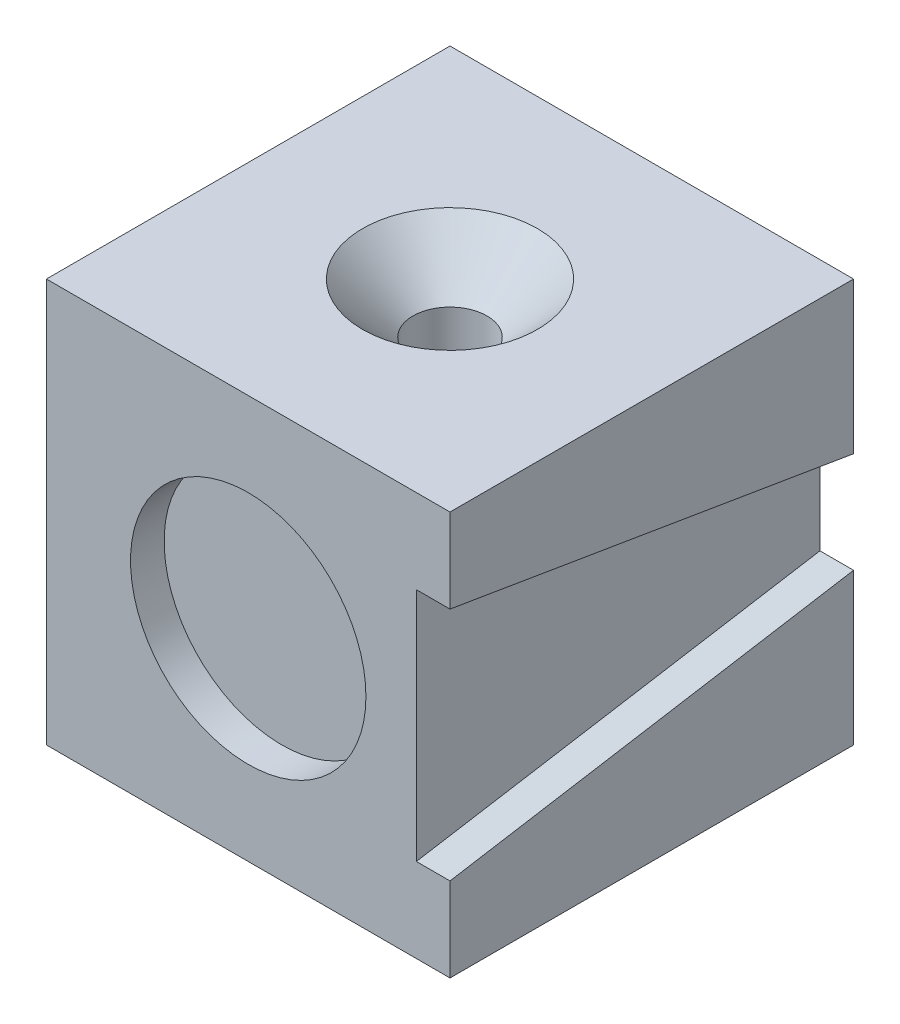
ISO-10303-21;
HEADER;
FILE_DESCRIPTION(('STEP AP214'),'2;1');
FILE_NAME('part.step','',(''),(''),'','','');
FILE_SCHEMA(('AUTOMOTIVE_DESIGN { 1 0 10303 214 1 1 1 1 }'));
ENDSEC;
DATA;
#1=APPLICATION_CONTEXT('core data for automotive mechanical design processes');
#2=APPLICATION_PROTOCOL_DEFINITION('international standard','automotive_design',2000,#1);
#3=PRODUCT_CONTEXT('',#1,'mechanical');
#4=PRODUCT('Part','Part','',(#3));
#5=PRODUCT_RELATED_PRODUCT_CATEGORY('part','',(#4));
#6=PRODUCT_DEFINITION_FORMATION('','',#4);
#7=PRODUCT_DEFINITION_CONTEXT('part definition',#1,'design');
#8=PRODUCT_DEFINITION('design','',#6,#7);
#9=PRODUCT_DEFINITION_SHAPE('','',#8);
#10=(LENGTH_UNIT() NAMED_UNIT(*) SI_UNIT(.MILLI.,.METRE.));
#11=(NAMED_UNIT(*) PLANE_ANGLE_UNIT() SI_UNIT($,.RADIAN.));
#12=(NAMED_UNIT(*) SI_UNIT($,.STERADIAN.) SOLID_ANGLE_UNIT());
#13=UNCERTAINTY_MEASURE_WITH_UNIT(LENGTH_MEASURE(1.E-05),#10,'distance_accuracy_value','');
#14=(GEOMETRIC_REPRESENTATION_CONTEXT(3) GLOBAL_UNCERTAINTY_ASSIGNED_CONTEXT((#13)) GLOBAL_UNIT_ASSIGNED_CONTEXT((#10,
#11,#12)) REPRESENTATION_CONTEXT('',''));
#15=CARTESIAN_POINT('',(0.,0.,0.));
#16=DIRECTION('',(0.,0.,1.));
#17=DIRECTION('',(1.,0.,0.));
#18=AXIS2_PLACEMENT_3D('',#15,#16,#17);
#19=CARTESIAN_POINT('',(-76.2,76.2,-76.2));
#20=DIRECTION('',(0.,0.,1.));
#21=DIRECTION('',(1.,0.,0.));
#22=AXIS2_PLACEMENT_3D('',#19,#20,#21);
#23=PLANE('',#22);
#24=DIRECTION('',(0.,-1.,0.));
#25=VECTOR('',#24,1.);
#26=CARTESIAN_POINT('',(76.2,76.2,-76.2));
#27=LINE('',#26,#25);
#28=CARTESIAN_POINT('',(76.2,76.2,-76.2));
#29=VERTEX_POINT('',#28);
#30=CARTESIAN_POINT('',(76.2,19.05,-76.2));
#31=VERTEX_POINT('',#30);
#32=EDGE_CURVE('E223',#29,#31,#27,.T.);
#33=ORIENTED_EDGE('',*,*,#32,.T.);
#34=DIRECTION('',(1.,0.,0.));
#35=VECTOR('',#34,1.);
#36=CARTESIAN_POINT('',(63.5,19.05,-76.2));
#37=LINE('',#36,#35);
#38=CARTESIAN_POINT('',(63.5,19.05,-76.2));
#39=VERTEX_POINT('',#38);
#40=EDGE_CURVE('E185',#39,#31,#37,.T.);
#41=ORIENTED_EDGE('',*,*,#40,.F.);
#42=DIRECTION('',(0.,1.,0.));
#43=VECTOR('',#42,1.);
#44=CARTESIAN_POINT('',(63.5,19.05,-76.2));
#45=LINE('',#44,#43);
#46=CARTESIAN_POINT('',(63.5000000000001,-19.05,-76.2));
#47=VERTEX_POINT('',#46);
#48=EDGE_CURVE('E173',#47,#39,#45,.T.);
#49=ORIENTED_EDGE('',*,*,#48,.F.);
#50=DIRECTION('',(1.,0.,0.));
#51=VECTOR('',#50,1.);
#52=CARTESIAN_POINT('',(63.5,-19.05,-76.2));
#53=LINE('',#52,#51);
#54=CARTESIAN_POINT('',(76.2,-19.05,-76.2));
#55=VERTEX_POINT('',#54);
#56=EDGE_CURVE('E187',#47,#55,#53,.T.);
#57=ORIENTED_EDGE('',*,*,#56,.T.);
#58=CARTESIAN_POINT('',(76.2,-76.2,-76.2));
#59=VERTEX_POINT('',#58);
#60=EDGE_CURVE('E222',#55,#59,#27,.T.);
#61=ORIENTED_EDGE('',*,*,#60,.T.);
#62=DIRECTION('',(-1.,0.,0.));
#63=VECTOR('',#62,1.);
#64=CARTESIAN_POINT('',(-76.2,-76.2,-76.2));
#65=LINE('',#64,#63);
#66=CARTESIAN_POINT('',(-76.2,-76.2,-76.2));
#67=VERTEX_POINT('',#66);
#68=EDGE_CURVE('E204',#59,#67,#65,.T.);
#69=ORIENTED_EDGE('',*,*,#68,.T.);
#70=DIRECTION('',(0.,-1.,0.));
#71=VECTOR('',#70,1.);
#72=CARTESIAN_POINT('',(-76.2,76.2,-76.2));
#73=LINE('',#72,#71);
#74=CARTESIAN_POINT('',(-76.2,76.2,-76.2));
#75=VERTEX_POINT('',#74);
#76=EDGE_CURVE('E210',#75,#67,#73,.T.);
#77=ORIENTED_EDGE('',*,*,#76,.F.);
#78=DIRECTION('',(-1.,0.,0.));
#79=VECTOR('',#78,1.);
#80=CARTESIAN_POINT('',(-76.2,76.2,-76.2));
#81=LINE('',#80,#79);
#82=EDGE_CURVE('E208',#29,#75,#81,.T.);
#83=ORIENTED_EDGE('',*,*,#82,.F.);
#84=EDGE_LOOP('',(#33,#41,#49,#57,#61,#69,#77,#83));
#85=FACE_BOUND('',#84,.T.);
#86=CARTESIAN_POINT('',(0.,0.,-76.2));
#87=DIRECTION('',(0.,0.,1.));
#88=DIRECTION('',(1.,0.,0.));
#89=AXIS2_PLACEMENT_3D('',#86,#87,#88);
#90=CIRCLE('',#89,25.4);
#91=CARTESIAN_POINT('',(25.4,0.,-76.2));
#92=VERTEX_POINT('',#91);
#93=EDGE_CURVE('E11',#92,#92,#90,.F.);
#94=ORIENTED_EDGE('',*,*,#93,.F.);
#95=EDGE_LOOP('',(#94));
#96=FACE_BOUND('',#95,.T.);
#97=ADVANCED_FACE('F32',(#85,#96),#23,.F.);
#98=CARTESIAN_POINT('',(76.2,76.2,-76.2));
#99=DIRECTION('',(-1.,0.,0.));
#100=DIRECTION('',(0.,0.,1.));
#101=AXIS2_PLACEMENT_3D('',#98,#99,#100);
#102=PLANE('',#101);
#103=DIRECTION('',(0.,-1.,0.));
#104=VECTOR('',#103,1.);
#105=CARTESIAN_POINT('',(76.2,76.2,76.2));
#106=LINE('',#105,#104);
#107=CARTESIAN_POINT('',(76.2,76.2,76.2));
#108=VERTEX_POINT('',#107);
#109=CARTESIAN_POINT('',(76.2,44.45,76.2));
#110=VERTEX_POINT('',#109);
#111=EDGE_CURVE('E227',#108,#110,#106,.T.);
#112=ORIENTED_EDGE('',*,*,#111,.T.);
#113=DIRECTION('',(0.,0.164398987305357,0.986393923832144));
#114=VECTOR('',#113,1.);
#115=CARTESIAN_POINT('',(76.2,44.45,76.2));
#116=LINE('',#115,#114);
#117=EDGE_CURVE('E171',#31,#110,#116,.T.);
#118=ORIENTED_EDGE('',*,*,#117,.F.);
#119=ORIENTED_EDGE('',*,*,#32,.F.);
#120=DIRECTION('',(0.,0.,-1.));
#121=VECTOR('',#120,1.);
#122=CARTESIAN_POINT('',(76.2,76.2,-76.2));
#123=LINE('',#122,#121);
#124=EDGE_CURVE('E206',#108,#29,#123,.T.);
#125=ORIENTED_EDGE('',*,*,#124,.F.);
#126=EDGE_LOOP('',(#112,#118,#119,#125));
#127=FACE_BOUND('',#126,.T.);
#128=ADVANCED_FACE('F264',(#127),#102,.F.);
#129=CARTESIAN_POINT('',(-76.2,76.2,-76.2));
#130=DIRECTION('',(1.,0.,0.));
#131=DIRECTION('',(0.,0.,-1.));
#132=AXIS2_PLACEMENT_3D('',#129,#130,#131);
#133=PLANE('',#132);
#134=DIRECTION('',(0.,0.,1.));
#135=VECTOR('',#134,1.);
#136=CARTESIAN_POINT('',(-76.2,-63.5,-63.5));
#137=LINE('',#136,#135);
#138=CARTESIAN_POINT('',(-76.2,-63.5,-63.5));
#139=VERTEX_POINT('',#138);
#140=CARTESIAN_POINT('',(-76.2,-63.5,63.5));
#141=VERTEX_POINT('',#140);
#142=EDGE_CURVE('E150',#139,#141,#137,.T.);
#143=ORIENTED_EDGE('',*,*,#142,.F.);
#144=DIRECTION('',(0.,-1.,0.));
#145=VECTOR('',#144,1.);
#146=CARTESIAN_POINT('',(-76.2,63.5,-63.5));
#147=LINE('',#146,#145);
#148=CARTESIAN_POINT('',(-76.2,63.5,-63.5));
#149=VERTEX_POINT('',#148);
#150=EDGE_CURVE('E47',#149,#139,#147,.T.);
#151=ORIENTED_EDGE('',*,*,#150,.F.);
#152=DIRECTION('',(0.,0.,-1.));
#153=VECTOR('',#152,1.);
#154=CARTESIAN_POINT('',(-76.2,63.5,-63.5));
#155=LINE('',#154,#153);
#156=CARTESIAN_POINT('',(-76.2,63.5,63.5));
#157=VERTEX_POINT('',#156);
#158=EDGE_CURVE('E141',#157,#149,#155,.T.);
#159=ORIENTED_EDGE('',*,*,#158,.F.);
#160=DIRECTION('',(0.,1.,0.));
#161=VECTOR('',#160,1.);
#162=CARTESIAN_POINT('',(-76.2,63.5,63.5));
#163=LINE('',#162,#161);
#164=EDGE_CURVE('E144',#141,#157,#163,.T.);
#165=ORIENTED_EDGE('',*,*,#164,.F.);
#166=EDGE_LOOP('',(#143,#151,#159,#165));
#167=FACE_BOUND('',#166,.T.);
#168=DIRECTION('',(0.,0.,1.));
#169=VECTOR('',#168,1.);
#170=CARTESIAN_POINT('',(-76.2,-76.2,-76.2));
#171=LINE('',#170,#169);
#172=CARTESIAN_POINT('',(-76.2,-76.2,76.2));
#173=VERTEX_POINT('',#172);
#174=EDGE_CURVE('E199',#67,#173,#171,.T.);
#175=ORIENTED_EDGE('',*,*,#174,.T.);
#176=DIRECTION('',(0.,-1.,0.));
#177=VECTOR('',#176,1.);
#178=CARTESIAN_POINT('',(-76.2,76.2,76.2));
#179=LINE('',#178,#177);
#180=CARTESIAN_POINT('',(-76.2,76.2,76.2));
#181=VERTEX_POINT('',#180);
#182=EDGE_CURVE('E40',#181,#173,#179,.T.);
#183=ORIENTED_EDGE('',*,*,#182,.F.);
#184=DIRECTION('',(0.,0.,1.));
#185=VECTOR('',#184,1.);
#186=CARTESIAN_POINT('',(-76.2,76.2,-76.2));
#187=LINE('',#186,#185);
#188=EDGE_CURVE('E200',#75,#181,#187,.T.);
#189=ORIENTED_EDGE('',*,*,#188,.F.);
#190=ORIENTED_EDGE('',*,*,#76,.T.);
#191=EDGE_LOOP('',(#175,#183,#189,#190));
#192=FACE_BOUND('',#191,.T.);
#193=ADVANCED_FACE('F34',(#167,#192),#133,.F.);
#194=CARTESIAN_POINT('',(-76.2,76.2,76.2));
#195=DIRECTION('',(0.,0.,-1.));
#196=DIRECTION('',(-1.,0.,0.));
#197=AXIS2_PLACEMENT_3D('',#194,#195,#196);
#198=PLANE('',#197);
#199=CARTESIAN_POINT('',(0.,0.,76.2));
#200=DIRECTION('',(0.,0.,1.));
#201=DIRECTION('',(1.,0.,0.));
#202=AXIS2_PLACEMENT_3D('',#199,#200,#201);
#203=CIRCLE('',#202,44.45);
#204=CARTESIAN_POINT('',(44.45,0.,76.2));
#205=VERTEX_POINT('',#204);
#206=EDGE_CURVE('E162',#205,#205,#203,.T.);
#207=ORIENTED_EDGE('',*,*,#206,.F.);
#208=EDGE_LOOP('',(#207));
#209=FACE_BOUND('',#208,.T.);
#210=DIRECTION('',(0.,-1.,0.));
#211=VECTOR('',#210,1.);
#212=CARTESIAN_POINT('',(63.5,-44.45,76.2));
#213=LINE('',#212,#211);
#214=CARTESIAN_POINT('',(63.5,44.45,76.2));
#215=VERTEX_POINT('',#214);
#216=CARTESIAN_POINT('',(63.5,-44.45,76.2));
#217=VERTEX_POINT('',#216);
#218=EDGE_CURVE('E169',#215,#217,#213,.T.);
#219=ORIENTED_EDGE('',*,*,#218,.F.);
#220=DIRECTION('',(1.,0.,0.));
#221=VECTOR('',#220,1.);
#222=CARTESIAN_POINT('',(63.5,44.45,76.2));
#223=LINE('',#222,#221);
#224=EDGE_CURVE('E181',#215,#110,#223,.T.);
#225=ORIENTED_EDGE('',*,*,#224,.T.);
#226=ORIENTED_EDGE('',*,*,#111,.F.);
#227=DIRECTION('',(1.,0.,0.));
#228=VECTOR('',#227,1.);
#229=CARTESIAN_POINT('',(-76.2,76.2,76.2));
#230=LINE('',#229,#228);
#231=EDGE_CURVE('E203',#181,#108,#230,.T.);
#232=ORIENTED_EDGE('',*,*,#231,.F.);
#233=ORIENTED_EDGE('',*,*,#182,.T.);
#234=DIRECTION('',(1.,0.,0.));
#235=VECTOR('',#234,1.);
#236=CARTESIAN_POINT('',(-76.2,-76.2,76.2));
#237=LINE('',#236,#235);
#238=CARTESIAN_POINT('',(76.2,-76.2,76.2));
#239=VERTEX_POINT('',#238);
#240=EDGE_CURVE('E213',#173,#239,#237,.T.);
#241=ORIENTED_EDGE('',*,*,#240,.T.);
#242=CARTESIAN_POINT('',(76.2,-44.45,76.2));
#243=VERTEX_POINT('',#242);
#244=EDGE_CURVE('E226',#243,#239,#106,.T.);
#245=ORIENTED_EDGE('',*,*,#244,.F.);
#246=DIRECTION('',(1.,0.,0.));
#247=VECTOR('',#246,1.);
#248=CARTESIAN_POINT('',(63.5,-44.45,76.2));
#249=LINE('',#248,#247);
#250=EDGE_CURVE('E178',#217,#243,#249,.T.);
#251=ORIENTED_EDGE('',*,*,#250,.F.);
#252=EDGE_LOOP('',(#219,#225,#226,#232,#233,#241,#245,#251));
#253=FACE_BOUND('',#252,.T.);
#254=ADVANCED_FACE('F233',(#209,#253),#198,.F.);
#255=ORIENTED_EDGE('',*,*,#60,.F.);
#256=DIRECTION('',(0.,0.164398987305357,-0.986393923832144));
#257=VECTOR('',#256,1.);
#258=CARTESIAN_POINT('',(76.2,-19.05,-76.2));
#259=LINE('',#258,#257);
#260=EDGE_CURVE('E166',#243,#55,#259,.T.);
#261=ORIENTED_EDGE('',*,*,#260,.F.);
#262=ORIENTED_EDGE('',*,*,#244,.T.);
#263=DIRECTION('',(0.,0.,-1.));
#264=VECTOR('',#263,1.);
#265=CARTESIAN_POINT('',(76.2,-76.2,-76.2));
#266=LINE('',#265,#264);
#267=EDGE_CURVE('E216',#239,#59,#266,.T.);
#268=ORIENTED_EDGE('',*,*,#267,.T.);
#269=EDGE_LOOP('',(#255,#261,#262,#268));
#270=FACE_BOUND('',#269,.T.);
#271=ADVANCED_FACE('F246',(#270),#102,.F.);
#272=CARTESIAN_POINT('',(0.,76.2,0.));
#273=DIRECTION('',(0.,1.,0.));
#274=DIRECTION('',(0.,0.,1.));
#275=AXIS2_PLACEMENT_3D('',#272,#273,#274);
#276=PLANE('',#275);
#277=CARTESIAN_POINT('',(0.,76.2,0.));
#278=DIRECTION('',(0.,-1.,0.));
#279=DIRECTION('',(0.,0.,-1.));
#280=AXIS2_PLACEMENT_3D('',#277,#278,#279);
#281=CIRCLE('',#280,33.0200000000002);
#282=CARTESIAN_POINT('',(0.,76.2,-33.0200000000002));
#283=VERTEX_POINT('',#282);
#284=EDGE_CURVE('E184',#283,#283,#281,.T.);
#285=ORIENTED_EDGE('',*,*,#284,.T.);
#286=EDGE_LOOP('',(#285));
#287=FACE_BOUND('',#286,.T.);
#288=ORIENTED_EDGE('',*,*,#188,.T.);
#289=ORIENTED_EDGE('',*,*,#231,.T.);
#290=ORIENTED_EDGE('',*,*,#124,.T.);
#291=ORIENTED_EDGE('',*,*,#82,.T.);
#292=EDGE_LOOP('',(#288,#289,#290,#291));
#293=FACE_BOUND('',#292,.T.);
#294=ADVANCED_FACE('F266',(#287,#293),#276,.T.);
#295=CARTESIAN_POINT('',(0.,-76.2,0.));
#296=DIRECTION('',(0.,1.,0.));
#297=DIRECTION('',(0.,0.,1.));
#298=AXIS2_PLACEMENT_3D('',#295,#296,#297);
#299=PLANE('',#298);
#300=ORIENTED_EDGE('',*,*,#174,.F.);
#301=ORIENTED_EDGE('',*,*,#68,.F.);
#302=ORIENTED_EDGE('',*,*,#267,.F.);
#303=ORIENTED_EDGE('',*,*,#240,.F.);
#304=EDGE_LOOP('',(#300,#301,#302,#303));
#305=FACE_BOUND('',#304,.T.);
#306=ADVANCED_FACE('F243',(#305),#299,.F.);
#307=CARTESIAN_POINT('',(0.,12.7,0.));
#308=DIRECTION('',(0.,-1.,0.));
#309=DIRECTION('',(0.,0.,-1.));
#310=AXIS2_PLACEMENT_3D('',#307,#308,#309);
#311=PLANE('',#310);
#312=CARTESIAN_POINT('',(0.,12.7,0.));
#313=DIRECTION('',(0.,-1.,0.));
#314=DIRECTION('',(0.,0.,-1.));
#315=AXIS2_PLACEMENT_3D('',#312,#313,#314);
#316=CIRCLE('',#315,13.97);
#317=CARTESIAN_POINT('',(0.,12.7,-13.97));
#318=VERTEX_POINT('',#317);
#319=EDGE_CURVE('E196',#318,#318,#316,.T.);
#320=ORIENTED_EDGE('',*,*,#319,.F.);
#321=EDGE_LOOP('',(#320));
#322=FACE_BOUND('',#321,.T.);
#323=ADVANCED_FACE('F274',(#322),#311,.F.);
#324=CARTESIAN_POINT('',(0.,0.,0.));
#325=DIRECTION('',(0.,-1.,0.));
#326=DIRECTION('',(0.,0.,-1.));
#327=AXIS2_PLACEMENT_3D('',#324,#325,#326);
#328=CYLINDRICAL_SURFACE('',#327,13.97);
#329=CARTESIAN_POINT('',(0.,57.15,0.));
#330=DIRECTION('',(0.,-1.,0.));
#331=DIRECTION('',(0.,0.,-1.));
#332=AXIS2_PLACEMENT_3D('',#329,#330,#331);
#333=CIRCLE('',#332,13.97);
#334=CARTESIAN_POINT('',(0.,57.15,-13.97));
#335=VERTEX_POINT('',#334);
#336=EDGE_CURVE('E193',#335,#335,#333,.T.);
#337=ORIENTED_EDGE('',*,*,#336,.F.);
#338=EDGE_LOOP('',(#337));
#339=FACE_BOUND('',#338,.T.);
#340=ORIENTED_EDGE('',*,*,#319,.T.);
#341=EDGE_LOOP('',(#340));
#342=FACE_BOUND('',#341,.T.);
#343=ADVANCED_FACE('F314',(#339,#342),#328,.F.);
#344=CARTESIAN_POINT('',(0.,57.15,0.));
#345=DIRECTION('',(0.,1.,0.));
#346=DIRECTION('',(0.,0.,1.));
#347=AXIS2_PLACEMENT_3D('',#344,#345,#346);
#348=CONICAL_SURFACE('',#347,13.97,0.785398163397453);
#349=ORIENTED_EDGE('',*,*,#284,.F.);
#350=EDGE_LOOP('',(#349));
#351=FACE_BOUND('',#350,.T.);
#352=ORIENTED_EDGE('',*,*,#336,.T.);
#353=EDGE_LOOP('',(#352));
#354=FACE_BOUND('',#353,.T.);
#355=ADVANCED_FACE('F309',(#351,#354),#348,.F.);
#356=CARTESIAN_POINT('',(63.5,44.45,76.2));
#357=DIRECTION('',(0.,0.986393923832144,-0.164398987305357));
#358=DIRECTION('',(0.,0.164398987305357,0.986393923832144));
#359=AXIS2_PLACEMENT_3D('',#356,#357,#358);
#360=PLANE('',#359);
#361=ORIENTED_EDGE('',*,*,#117,.T.);
#362=ORIENTED_EDGE('',*,*,#224,.F.);
#363=DIRECTION('',(0.,0.164398987305357,0.986393923832144));
#364=VECTOR('',#363,1.);
#365=CARTESIAN_POINT('',(63.5,44.45,76.2));
#366=LINE('',#365,#364);
#367=EDGE_CURVE('E175',#39,#215,#366,.T.);
#368=ORIENTED_EDGE('',*,*,#367,.F.);
#369=ORIENTED_EDGE('',*,*,#40,.T.);
#370=EDGE_LOOP('',(#361,#362,#368,#369));
#371=FACE_BOUND('',#370,.T.);
#372=ADVANCED_FACE('F256',(#371),#360,.F.);
#373=CARTESIAN_POINT('',(63.5,-19.05,-76.2));
#374=DIRECTION('',(0.,-0.986393923832144,-0.164398987305357));
#375=DIRECTION('',(0.,0.164398987305357,-0.986393923832144));
#376=AXIS2_PLACEMENT_3D('',#373,#374,#375);
#377=PLANE('',#376);
#378=ORIENTED_EDGE('',*,*,#260,.T.);
#379=ORIENTED_EDGE('',*,*,#56,.F.);
#380=DIRECTION('',(0.,0.164398987305357,-0.986393923832144));
#381=VECTOR('',#380,1.);
#382=CARTESIAN_POINT('',(63.5,-19.05,-76.2));
#383=LINE('',#382,#381);
#384=EDGE_CURVE('E55',#217,#47,#383,.T.);
#385=ORIENTED_EDGE('',*,*,#384,.F.);
#386=ORIENTED_EDGE('',*,*,#250,.T.);
#387=EDGE_LOOP('',(#378,#379,#385,#386));
#388=FACE_BOUND('',#387,.T.);
#389=ADVANCED_FACE('F250',(#388),#377,.F.);
#390=CARTESIAN_POINT('',(63.5,0.,0.));
#391=DIRECTION('',(-1.,0.,0.));
#392=DIRECTION('',(0.,0.,1.));
#393=AXIS2_PLACEMENT_3D('',#390,#391,#392);
#394=PLANE('',#393);
#395=ORIENTED_EDGE('',*,*,#218,.T.);
#396=ORIENTED_EDGE('',*,*,#384,.T.);
#397=ORIENTED_EDGE('',*,*,#48,.T.);
#398=ORIENTED_EDGE('',*,*,#367,.T.);
#399=EDGE_LOOP('',(#395,#396,#397,#398));
#400=FACE_BOUND('',#399,.T.);
#401=ADVANCED_FACE('F252',(#400),#394,.F.);
#402=CARTESIAN_POINT('',(0.,0.,63.5));
#403=DIRECTION('',(0.,0.,1.));
#404=DIRECTION('',(1.,0.,0.));
#405=AXIS2_PLACEMENT_3D('',#402,#403,#404);
#406=CYLINDRICAL_SURFACE('',#405,44.45);
#407=CARTESIAN_POINT('',(0.,0.,63.5));
#408=DIRECTION('',(0.,0.,1.));
#409=DIRECTION('',(1.,0.,0.));
#410=AXIS2_PLACEMENT_3D('',#407,#408,#409);
#411=CIRCLE('',#410,44.45);
#412=CARTESIAN_POINT('',(44.45,0.,63.5));
#413=VERTEX_POINT('',#412);
#414=EDGE_CURVE('E163',#413,#413,#411,.T.);
#415=ORIENTED_EDGE('',*,*,#414,.F.);
#416=EDGE_LOOP('',(#415));
#417=FACE_BOUND('',#416,.T.);
#418=ORIENTED_EDGE('',*,*,#206,.T.);
#419=EDGE_LOOP('',(#418));
#420=FACE_BOUND('',#419,.T.);
#421=ADVANCED_FACE('F291',(#417,#420),#406,.F.);
#422=CARTESIAN_POINT('',(0.,0.,63.5));
#423=DIRECTION('',(0.,0.,1.));
#424=DIRECTION('',(1.,0.,0.));
#425=AXIS2_PLACEMENT_3D('',#422,#423,#424);
#426=PLANE('',#425);
#427=ORIENTED_EDGE('',*,*,#414,.T.);
#428=EDGE_LOOP('',(#427));
#429=FACE_BOUND('',#428,.T.);
#430=ADVANCED_FACE('F293',(#429),#426,.T.);
#431=CARTESIAN_POINT('',(0.,0.,-101.6));
#432=DIRECTION('',(0.,0.,1.));
#433=DIRECTION('',(1.,0.,0.));
#434=AXIS2_PLACEMENT_3D('',#431,#432,#433);
#435=CYLINDRICAL_SURFACE('',#434,25.4);
#436=CARTESIAN_POINT('',(0.,0.,-101.6));
#437=DIRECTION('',(0.,0.,-1.));
#438=DIRECTION('',(-1.,0.,0.));
#439=AXIS2_PLACEMENT_3D('',#436,#437,#438);
#440=CIRCLE('',#439,25.4);
#441=CARTESIAN_POINT('',(-25.4,0.,-101.6));
#442=VERTEX_POINT('',#441);
#443=EDGE_CURVE('E156',#442,#442,#440,.T.);
#444=ORIENTED_EDGE('',*,*,#443,.F.);
#445=EDGE_LOOP('',(#444));
#446=FACE_BOUND('',#445,.T.);
#447=ORIENTED_EDGE('',*,*,#93,.T.);
#448=EDGE_LOOP('',(#447));
#449=FACE_BOUND('',#448,.T.);
#450=ADVANCED_FACE('F300',(#446,#449),#435,.T.);
#451=CARTESIAN_POINT('',(0.,0.,-101.6));
#452=DIRECTION('',(0.,0.,-1.));
#453=DIRECTION('',(-1.,0.,0.));
#454=AXIS2_PLACEMENT_3D('',#451,#452,#453);
#455=PLANE('',#454);
#456=ORIENTED_EDGE('',*,*,#443,.T.);
#457=EDGE_LOOP('',(#456));
#458=FACE_BOUND('',#457,.T.);
#459=ADVANCED_FACE('F377',(#458),#455,.T.);
#460=CARTESIAN_POINT('',(-63.5,63.5,-63.5));
#461=DIRECTION('',(0.,0.,-1.));
#462=DIRECTION('',(-1.,0.,0.));
#463=AXIS2_PLACEMENT_3D('',#460,#461,#462);
#464=PLANE('',#463);
#465=ORIENTED_EDGE('',*,*,#150,.T.);
#466=DIRECTION('',(-1.,0.,0.));
#467=VECTOR('',#466,1.);
#468=CARTESIAN_POINT('',(-63.5,-63.5,-63.5));
#469=LINE('',#468,#467);
#470=CARTESIAN_POINT('',(-63.5,-63.5,-63.5));
#471=VERTEX_POINT('',#470);
#472=EDGE_CURVE('E119',#471,#139,#469,.T.);
#473=ORIENTED_EDGE('',*,*,#472,.F.);
#474=DIRECTION('',(0.,-1.,0.));
#475=VECTOR('',#474,1.);
#476=CARTESIAN_POINT('',(-63.5,63.5,-63.5));
#477=LINE('',#476,#475);
#478=CARTESIAN_POINT('',(-63.5,63.5,-63.5));
#479=VERTEX_POINT('',#478);
#480=EDGE_CURVE('E123',#479,#471,#477,.T.);
#481=ORIENTED_EDGE('',*,*,#480,.F.);
#482=DIRECTION('',(-1.,0.,0.));
#483=VECTOR('',#482,1.);
#484=CARTESIAN_POINT('',(-63.5,63.5,-63.5));
#485=LINE('',#484,#483);
#486=EDGE_CURVE('E154',#479,#149,#485,.T.);
#487=ORIENTED_EDGE('',*,*,#486,.T.);
#488=EDGE_LOOP('',(#465,#473,#481,#487));
#489=FACE_BOUND('',#488,.T.);
#490=ADVANCED_FACE('F121',(#489),#464,.F.);
#491=CARTESIAN_POINT('',(-63.5,63.5,-63.5));
#492=DIRECTION('',(0.,1.,0.));
#493=DIRECTION('',(0.,0.,1.));
#494=AXIS2_PLACEMENT_3D('',#491,#492,#493);
#495=PLANE('',#494);
#496=ORIENTED_EDGE('',*,*,#158,.T.);
#497=ORIENTED_EDGE('',*,*,#486,.F.);
#498=DIRECTION('',(0.,0.,-1.));
#499=VECTOR('',#498,1.);
#500=CARTESIAN_POINT('',(-63.5,63.5,-63.5));
#501=LINE('',#500,#499);
#502=CARTESIAN_POINT('',(-63.5,63.5,63.5));
#503=VERTEX_POINT('',#502);
#504=EDGE_CURVE('E129',#503,#479,#501,.T.);
#505=ORIENTED_EDGE('',*,*,#504,.F.);
#506=DIRECTION('',(-1.,0.,0.));
#507=VECTOR('',#506,1.);
#508=CARTESIAN_POINT('',(-63.5,63.5,63.5));
#509=LINE('',#508,#507);
#510=EDGE_CURVE('E157',#503,#157,#509,.T.);
#511=ORIENTED_EDGE('',*,*,#510,.T.);
#512=EDGE_LOOP('',(#496,#497,#505,#511));
#513=FACE_BOUND('',#512,.T.);
#514=ADVANCED_FACE('F400',(#513),#495,.F.);
#515=CARTESIAN_POINT('',(-63.5,63.5,63.5));
#516=DIRECTION('',(0.,0.,1.));
#517=DIRECTION('',(1.,0.,0.));
#518=AXIS2_PLACEMENT_3D('',#515,#516,#517);
#519=PLANE('',#518);
#520=ORIENTED_EDGE('',*,*,#164,.T.);
#521=ORIENTED_EDGE('',*,*,#510,.F.);
#522=DIRECTION('',(0.,1.,0.));
#523=VECTOR('',#522,1.);
#524=CARTESIAN_POINT('',(-63.5,63.5,63.5));
#525=LINE('',#524,#523);
#526=CARTESIAN_POINT('',(-63.5,-63.5,63.5));
#527=VERTEX_POINT('',#526);
#528=EDGE_CURVE('E137',#527,#503,#525,.T.);
#529=ORIENTED_EDGE('',*,*,#528,.F.);
#530=DIRECTION('',(-1.,0.,0.));
#531=VECTOR('',#530,1.);
#532=CARTESIAN_POINT('',(-63.5,-63.5,63.5));
#533=LINE('',#532,#531);
#534=EDGE_CURVE('E128',#527,#141,#533,.T.);
#535=ORIENTED_EDGE('',*,*,#534,.T.);
#536=EDGE_LOOP('',(#520,#521,#529,#535));
#537=FACE_BOUND('',#536,.T.);
#538=ADVANCED_FACE('F409',(#537),#519,.F.);
#539=CARTESIAN_POINT('',(-63.5,-63.5,-63.5));
#540=DIRECTION('',(0.,-1.,0.));
#541=DIRECTION('',(0.,0.,-1.));
#542=AXIS2_PLACEMENT_3D('',#539,#540,#541);
#543=PLANE('',#542);
#544=ORIENTED_EDGE('',*,*,#142,.T.);
#545=ORIENTED_EDGE('',*,*,#534,.F.);
#546=DIRECTION('',(0.,0.,1.));
#547=VECTOR('',#546,1.);
#548=CARTESIAN_POINT('',(-63.5,-63.5,-63.5));
#549=LINE('',#548,#547);
#550=EDGE_CURVE('E132',#471,#527,#549,.T.);
#551=ORIENTED_EDGE('',*,*,#550,.F.);
#552=ORIENTED_EDGE('',*,*,#472,.T.);
#553=EDGE_LOOP('',(#544,#545,#551,#552));
#554=FACE_BOUND('',#553,.T.);
#555=ADVANCED_FACE('F133',(#554),#543,.F.);
#556=CARTESIAN_POINT('',(-63.5,0.,0.));
#557=DIRECTION('',(-1.,0.,0.));
#558=DIRECTION('',(0.,0.,1.));
#559=AXIS2_PLACEMENT_3D('',#556,#557,#558);
#560=PLANE('',#559);
#561=ORIENTED_EDGE('',*,*,#480,.T.);
#562=ORIENTED_EDGE('',*,*,#550,.T.);
#563=ORIENTED_EDGE('',*,*,#528,.T.);
#564=ORIENTED_EDGE('',*,*,#504,.T.);
#565=EDGE_LOOP('',(#561,#562,#563,#564));
#566=FACE_BOUND('',#565,.T.);
#567=ADVANCED_FACE('F139',(#566),#560,.T.);
#568=CLOSED_SHELL('',(#97,#128,#193,#254,#271,#294,#306,#323,#343,#355,#372,#389,#401,#421,#430,
#450,#459,#490,#514,#538,#555,#567));
#569=MANIFOLD_SOLID_BREP('B2',#568);
#570=ADVANCED_BREP_SHAPE_REPRESENTATION('',(#18,#569),#14);
#571=SHAPE_DEFINITION_REPRESENTATION(#9,#570);
ENDSEC;
END-ISO-10303-21;
